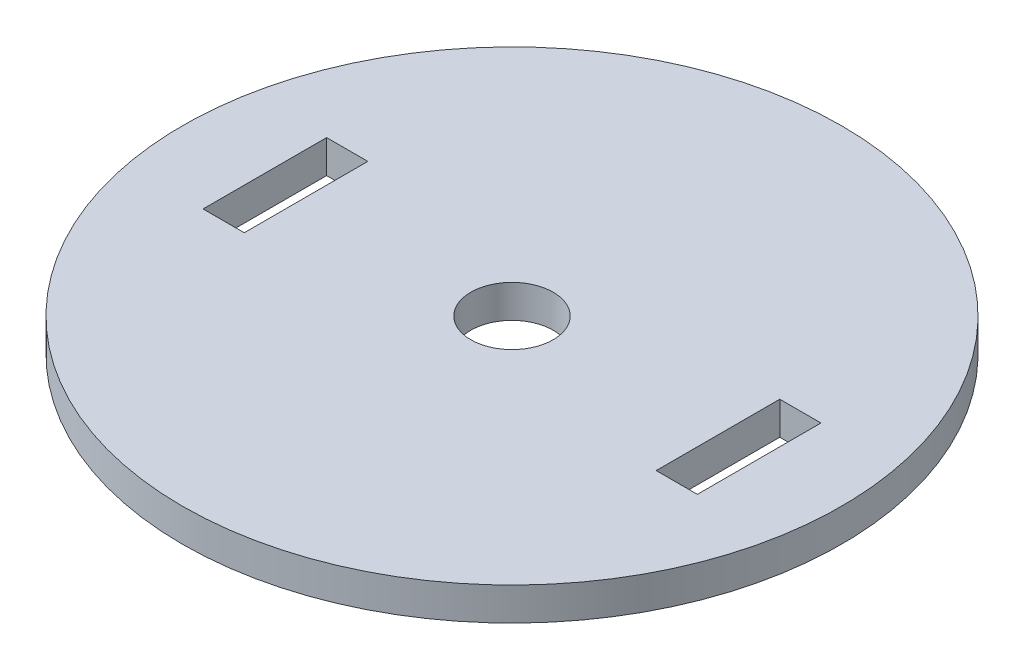
ISO-10303-21;
HEADER;
FILE_DESCRIPTION(('STEP AP214'),'2;1');
FILE_NAME('part.step','',(''),(''),'','','');
FILE_SCHEMA(('AUTOMOTIVE_DESIGN { 1 0 10303 214 1 1 1 1 }'));
ENDSEC;
DATA;
#1=APPLICATION_CONTEXT('core data for automotive mechanical design processes');
#2=APPLICATION_PROTOCOL_DEFINITION('international standard','automotive_design',2000,#1);
#3=PRODUCT_CONTEXT('',#1,'mechanical');
#4=PRODUCT('Part','Part','',(#3));
#5=PRODUCT_RELATED_PRODUCT_CATEGORY('part','',(#4));
#6=PRODUCT_DEFINITION_FORMATION('','',#4);
#7=PRODUCT_DEFINITION_CONTEXT('part definition',#1,'design');
#8=PRODUCT_DEFINITION('design','',#6,#7);
#9=PRODUCT_DEFINITION_SHAPE('','',#8);
#10=(LENGTH_UNIT() NAMED_UNIT(*) SI_UNIT(.MILLI.,.METRE.));
#11=(NAMED_UNIT(*) PLANE_ANGLE_UNIT() SI_UNIT($,.RADIAN.));
#12=(NAMED_UNIT(*) SI_UNIT($,.STERADIAN.) SOLID_ANGLE_UNIT());
#13=UNCERTAINTY_MEASURE_WITH_UNIT(LENGTH_MEASURE(1.E-05),#10,'distance_accuracy_value','');
#14=(GEOMETRIC_REPRESENTATION_CONTEXT(3) GLOBAL_UNCERTAINTY_ASSIGNED_CONTEXT((#13)) GLOBAL_UNIT_ASSIGNED_CONTEXT((#10,
#11,#12)) REPRESENTATION_CONTEXT('',''));
#15=CARTESIAN_POINT('',(0.,0.,0.));
#16=DIRECTION('',(0.,0.,1.));
#17=DIRECTION('',(1.,0.,0.));
#18=AXIS2_PLACEMENT_3D('',#15,#16,#17);
#19=CARTESIAN_POINT('',(0.,4.,0.));
#20=DIRECTION('',(0.,1.,0.));
#21=DIRECTION('',(0.,0.,1.));
#22=AXIS2_PLACEMENT_3D('',#19,#20,#21);
#23=PLANE('',#22);
#24=DIRECTION('',(0.,0.,-1.));
#25=VECTOR('',#24,1.);
#26=CARTESIAN_POINT('',(-25.,4.,7.49999999999999));
#27=LINE('',#26,#25);
#28=CARTESIAN_POINT('',(-25.,4.,7.49999999999999));
#29=VERTEX_POINT('',#28);
#30=CARTESIAN_POINT('',(-25.,4.,-7.50000000000001));
#31=VERTEX_POINT('',#30);
#32=EDGE_CURVE('E129',#29,#31,#27,.T.);
#33=ORIENTED_EDGE('',*,*,#32,.F.);
#34=DIRECTION('',(1.,0.,0.));
#35=VECTOR('',#34,1.);
#36=CARTESIAN_POINT('',(-30.,4.,7.49999999999999));
#37=LINE('',#36,#35);
#38=CARTESIAN_POINT('',(-30.,4.,7.49999999999999));
#39=VERTEX_POINT('',#38);
#40=EDGE_CURVE('E137',#39,#29,#37,.T.);
#41=ORIENTED_EDGE('',*,*,#40,.F.);
#42=DIRECTION('',(0.,0.,1.));
#43=VECTOR('',#42,1.);
#44=CARTESIAN_POINT('',(-30.,4.,7.49999999999999));
#45=LINE('',#44,#43);
#46=CARTESIAN_POINT('',(-30.,4.,-7.50000000000001));
#47=VERTEX_POINT('',#46);
#48=EDGE_CURVE('E151',#47,#39,#45,.T.);
#49=ORIENTED_EDGE('',*,*,#48,.F.);
#50=DIRECTION('',(-1.,0.,0.));
#51=VECTOR('',#50,1.);
#52=CARTESIAN_POINT('',(-30.,4.,-7.50000000000001));
#53=LINE('',#52,#51);
#54=EDGE_CURVE('E148',#31,#47,#53,.T.);
#55=ORIENTED_EDGE('',*,*,#54,.F.);
#56=EDGE_LOOP('',(#33,#41,#49,#55));
#57=FACE_BOUND('',#56,.T.);
#58=CARTESIAN_POINT('',(0.,4.,0.));
#59=DIRECTION('',(0.,1.,0.));
#60=DIRECTION('',(0.,0.,1.));
#61=AXIS2_PLACEMENT_3D('',#58,#59,#60);
#62=CIRCLE('',#61,40.);
#63=CARTESIAN_POINT('',(0.,4.,40.));
#64=VERTEX_POINT('',#63);
#65=EDGE_CURVE('E11',#64,#64,#62,.T.);
#66=ORIENTED_EDGE('',*,*,#65,.T.);
#67=EDGE_LOOP('',(#66));
#68=FACE_BOUND('',#67,.T.);
#69=CARTESIAN_POINT('',(0.,4.,0.));
#70=DIRECTION('',(0.,1.,0.));
#71=DIRECTION('',(0.,0.,1.));
#72=AXIS2_PLACEMENT_3D('',#69,#70,#71);
#73=CIRCLE('',#72,5.);
#74=CARTESIAN_POINT('',(0.,4.,5.));
#75=VERTEX_POINT('',#74);
#76=EDGE_CURVE('E165',#75,#75,#73,.T.);
#77=ORIENTED_EDGE('',*,*,#76,.F.);
#78=EDGE_LOOP('',(#77));
#79=FACE_BOUND('',#78,.T.);
#80=DIRECTION('',(-1.,0.,0.));
#81=VECTOR('',#80,1.);
#82=CARTESIAN_POINT('',(30.,4.,7.49999999999999));
#83=LINE('',#82,#81);
#84=CARTESIAN_POINT('',(30.,4.,7.49999999999999));
#85=VERTEX_POINT('',#84);
#86=CARTESIAN_POINT('',(25.,4.,7.49999999999999));
#87=VERTEX_POINT('',#86);
#88=EDGE_CURVE('E123',#85,#87,#83,.T.);
#89=ORIENTED_EDGE('',*,*,#88,.T.);
#90=DIRECTION('',(0.,0.,-1.));
#91=VECTOR('',#90,1.);
#92=CARTESIAN_POINT('',(25.,4.,7.49999999999999));
#93=LINE('',#92,#91);
#94=CARTESIAN_POINT('',(25.,4.,-7.50000000000001));
#95=VERTEX_POINT('',#94);
#96=EDGE_CURVE('E48',#87,#95,#93,.T.);
#97=ORIENTED_EDGE('',*,*,#96,.T.);
#98=DIRECTION('',(1.,0.,0.));
#99=VECTOR('',#98,1.);
#100=CARTESIAN_POINT('',(30.,4.,-7.50000000000001));
#101=LINE('',#100,#99);
#102=CARTESIAN_POINT('',(30.,4.,-7.50000000000001));
#103=VERTEX_POINT('',#102);
#104=EDGE_CURVE('E114',#95,#103,#101,.T.);
#105=ORIENTED_EDGE('',*,*,#104,.T.);
#106=DIRECTION('',(0.,0.,1.));
#107=VECTOR('',#106,1.);
#108=CARTESIAN_POINT('',(30.,4.,7.49999999999999));
#109=LINE('',#108,#107);
#110=EDGE_CURVE('E117',#103,#85,#109,.T.);
#111=ORIENTED_EDGE('',*,*,#110,.T.);
#112=EDGE_LOOP('',(#89,#97,#105,#111));
#113=FACE_BOUND('',#112,.T.);
#114=ADVANCED_FACE('F33',(#57,#68,#79,#113),#23,.T.);
#115=CARTESIAN_POINT('',(0.,0.,0.));
#116=DIRECTION('',(0.,1.,0.));
#117=DIRECTION('',(0.,0.,1.));
#118=AXIS2_PLACEMENT_3D('',#115,#116,#117);
#119=PLANE('',#118);
#120=CARTESIAN_POINT('',(0.,0.,0.));
#121=DIRECTION('',(0.,1.,0.));
#122=DIRECTION('',(0.,0.,1.));
#123=AXIS2_PLACEMENT_3D('',#120,#121,#122);
#124=CIRCLE('',#123,5.);
#125=CARTESIAN_POINT('',(0.,0.,5.));
#126=VERTEX_POINT('',#125);
#127=EDGE_CURVE('E158',#126,#126,#124,.T.);
#128=ORIENTED_EDGE('',*,*,#127,.T.);
#129=EDGE_LOOP('',(#128));
#130=FACE_BOUND('',#129,.T.);
#131=CARTESIAN_POINT('',(0.,0.,0.));
#132=DIRECTION('',(0.,1.,0.));
#133=DIRECTION('',(0.,0.,1.));
#134=AXIS2_PLACEMENT_3D('',#131,#132,#133);
#135=CIRCLE('',#134,40.);
#136=CARTESIAN_POINT('',(0.,0.,40.));
#137=VERTEX_POINT('',#136);
#138=EDGE_CURVE('E37',#137,#137,#135,.T.);
#139=ORIENTED_EDGE('',*,*,#138,.F.);
#140=EDGE_LOOP('',(#139));
#141=FACE_BOUND('',#140,.T.);
#142=DIRECTION('',(1.,0.,0.));
#143=VECTOR('',#142,1.);
#144=CARTESIAN_POINT('',(-30.,0.,7.49999999999999));
#145=LINE('',#144,#143);
#146=CARTESIAN_POINT('',(-30.,0.,7.49999999999999));
#147=VERTEX_POINT('',#146);
#148=CARTESIAN_POINT('',(-25.,0.,7.49999999999999));
#149=VERTEX_POINT('',#148);
#150=EDGE_CURVE('E143',#147,#149,#145,.T.);
#151=ORIENTED_EDGE('',*,*,#150,.T.);
#152=DIRECTION('',(0.,0.,-1.));
#153=VECTOR('',#152,1.);
#154=CARTESIAN_POINT('',(-25.,0.,7.49999999999999));
#155=LINE('',#154,#153);
#156=CARTESIAN_POINT('',(-25.,0.,-7.50000000000001));
#157=VERTEX_POINT('',#156);
#158=EDGE_CURVE('E133',#149,#157,#155,.T.);
#159=ORIENTED_EDGE('',*,*,#158,.T.);
#160=DIRECTION('',(-1.,0.,0.));
#161=VECTOR('',#160,1.);
#162=CARTESIAN_POINT('',(-30.,0.,-7.50000000000001));
#163=LINE('',#162,#161);
#164=CARTESIAN_POINT('',(-30.,0.,-7.50000000000001));
#165=VERTEX_POINT('',#164);
#166=EDGE_CURVE('E136',#157,#165,#163,.T.);
#167=ORIENTED_EDGE('',*,*,#166,.T.);
#168=DIRECTION('',(0.,0.,1.));
#169=VECTOR('',#168,1.);
#170=CARTESIAN_POINT('',(-30.,0.,7.49999999999999));
#171=LINE('',#170,#169);
#172=EDGE_CURVE('E140',#165,#147,#171,.T.);
#173=ORIENTED_EDGE('',*,*,#172,.T.);
#174=EDGE_LOOP('',(#151,#159,#167,#173));
#175=FACE_BOUND('',#174,.T.);
#176=DIRECTION('',(0.,0.,-1.));
#177=VECTOR('',#176,1.);
#178=CARTESIAN_POINT('',(25.,0.,7.49999999999999));
#179=LINE('',#178,#177);
#180=CARTESIAN_POINT('',(25.,0.,7.49999999999999));
#181=VERTEX_POINT('',#180);
#182=CARTESIAN_POINT('',(25.,0.,-7.50000000000001));
#183=VERTEX_POINT('',#182);
#184=EDGE_CURVE('E106',#181,#183,#179,.T.);
#185=ORIENTED_EDGE('',*,*,#184,.F.);
#186=DIRECTION('',(-1.,0.,0.));
#187=VECTOR('',#186,1.);
#188=CARTESIAN_POINT('',(30.,0.,7.49999999999999));
#189=LINE('',#188,#187);
#190=CARTESIAN_POINT('',(30.,0.,7.49999999999999));
#191=VERTEX_POINT('',#190);
#192=EDGE_CURVE('E98',#191,#181,#189,.T.);
#193=ORIENTED_EDGE('',*,*,#192,.F.);
#194=DIRECTION('',(0.,0.,1.));
#195=VECTOR('',#194,1.);
#196=CARTESIAN_POINT('',(30.,0.,7.49999999999999));
#197=LINE('',#196,#195);
#198=CARTESIAN_POINT('',(30.,0.,-7.50000000000001));
#199=VERTEX_POINT('',#198);
#200=EDGE_CURVE('E105',#199,#191,#197,.T.);
#201=ORIENTED_EDGE('',*,*,#200,.F.);
#202=DIRECTION('',(1.,0.,0.));
#203=VECTOR('',#202,1.);
#204=CARTESIAN_POINT('',(30.,0.,-7.50000000000001));
#205=LINE('',#204,#203);
#206=EDGE_CURVE('E110',#183,#199,#205,.T.);
#207=ORIENTED_EDGE('',*,*,#206,.F.);
#208=EDGE_LOOP('',(#185,#193,#201,#207));
#209=FACE_BOUND('',#208,.T.);
#210=ADVANCED_FACE('F113',(#130,#141,#175,#209),#119,.F.);
#211=CARTESIAN_POINT('',(0.,4.,0.));
#212=DIRECTION('',(0.,-1.,0.));
#213=DIRECTION('',(0.,0.,-1.));
#214=AXIS2_PLACEMENT_3D('',#211,#212,#213);
#215=CYLINDRICAL_SURFACE('',#214,40.);
#216=ORIENTED_EDGE('',*,*,#65,.F.);
#217=EDGE_LOOP('',(#216));
#218=FACE_BOUND('',#217,.T.);
#219=ORIENTED_EDGE('',*,*,#138,.T.);
#220=EDGE_LOOP('',(#219));
#221=FACE_BOUND('',#220,.T.);
#222=ADVANCED_FACE('F35',(#218,#221),#215,.T.);
#223=CARTESIAN_POINT('',(0.,4.,0.));
#224=DIRECTION('',(0.,-1.,0.));
#225=DIRECTION('',(0.,0.,-1.));
#226=AXIS2_PLACEMENT_3D('',#223,#224,#225);
#227=CYLINDRICAL_SURFACE('',#226,5.);
#228=ORIENTED_EDGE('',*,*,#76,.T.);
#229=EDGE_LOOP('',(#228));
#230=FACE_BOUND('',#229,.T.);
#231=ORIENTED_EDGE('',*,*,#127,.F.);
#232=EDGE_LOOP('',(#231));
#233=FACE_BOUND('',#232,.T.);
#234=ADVANCED_FACE('F173',(#230,#233),#227,.F.);
#235=CARTESIAN_POINT('',(-25.,0.,7.49999999999999));
#236=DIRECTION('',(1.,0.,0.));
#237=DIRECTION('',(0.,0.,-1.));
#238=AXIS2_PLACEMENT_3D('',#235,#236,#237);
#239=PLANE('',#238);
#240=ORIENTED_EDGE('',*,*,#32,.T.);
#241=DIRECTION('',(0.,1.,0.));
#242=VECTOR('',#241,1.);
#243=CARTESIAN_POINT('',(-25.,0.,-7.50000000000001));
#244=LINE('',#243,#242);
#245=EDGE_CURVE('E146',#157,#31,#244,.T.);
#246=ORIENTED_EDGE('',*,*,#245,.F.);
#247=ORIENTED_EDGE('',*,*,#158,.F.);
#248=DIRECTION('',(0.,1.,0.));
#249=VECTOR('',#248,1.);
#250=CARTESIAN_POINT('',(-25.,0.,7.49999999999999));
#251=LINE('',#250,#249);
#252=EDGE_CURVE('E156',#149,#29,#251,.T.);
#253=ORIENTED_EDGE('',*,*,#252,.T.);
#254=EDGE_LOOP('',(#240,#246,#247,#253));
#255=FACE_BOUND('',#254,.T.);
#256=ADVANCED_FACE('F175',(#255),#239,.F.);
#257=CARTESIAN_POINT('',(-30.,0.,7.49999999999999));
#258=DIRECTION('',(0.,0.,1.));
#259=DIRECTION('',(1.,0.,0.));
#260=AXIS2_PLACEMENT_3D('',#257,#258,#259);
#261=PLANE('',#260);
#262=ORIENTED_EDGE('',*,*,#40,.T.);
#263=ORIENTED_EDGE('',*,*,#252,.F.);
#264=ORIENTED_EDGE('',*,*,#150,.F.);
#265=DIRECTION('',(0.,1.,0.));
#266=VECTOR('',#265,1.);
#267=CARTESIAN_POINT('',(-30.,0.,7.49999999999999));
#268=LINE('',#267,#266);
#269=EDGE_CURVE('E159',#147,#39,#268,.T.);
#270=ORIENTED_EDGE('',*,*,#269,.T.);
#271=EDGE_LOOP('',(#262,#263,#264,#270));
#272=FACE_BOUND('',#271,.T.);
#273=ADVANCED_FACE('F182',(#272),#261,.F.);
#274=CARTESIAN_POINT('',(-30.,0.,7.49999999999999));
#275=DIRECTION('',(-1.,0.,0.));
#276=DIRECTION('',(0.,0.,1.));
#277=AXIS2_PLACEMENT_3D('',#274,#275,#276);
#278=PLANE('',#277);
#279=ORIENTED_EDGE('',*,*,#48,.T.);
#280=ORIENTED_EDGE('',*,*,#269,.F.);
#281=ORIENTED_EDGE('',*,*,#172,.F.);
#282=DIRECTION('',(0.,1.,0.));
#283=VECTOR('',#282,1.);
#284=CARTESIAN_POINT('',(-30.,0.,-7.50000000000001));
#285=LINE('',#284,#283);
#286=EDGE_CURVE('E161',#165,#47,#285,.T.);
#287=ORIENTED_EDGE('',*,*,#286,.T.);
#288=EDGE_LOOP('',(#279,#280,#281,#287));
#289=FACE_BOUND('',#288,.T.);
#290=ADVANCED_FACE('F220',(#289),#278,.F.);
#291=CARTESIAN_POINT('',(-30.,0.,-7.50000000000001));
#292=DIRECTION('',(0.,0.,-1.));
#293=DIRECTION('',(-1.,0.,0.));
#294=AXIS2_PLACEMENT_3D('',#291,#292,#293);
#295=PLANE('',#294);
#296=ORIENTED_EDGE('',*,*,#54,.T.);
#297=ORIENTED_EDGE('',*,*,#286,.F.);
#298=ORIENTED_EDGE('',*,*,#166,.F.);
#299=ORIENTED_EDGE('',*,*,#245,.T.);
#300=EDGE_LOOP('',(#296,#297,#298,#299));
#301=FACE_BOUND('',#300,.T.);
#302=ADVANCED_FACE('F213',(#301),#295,.F.);
#303=CARTESIAN_POINT('',(25.,0.,7.49999999999999));
#304=DIRECTION('',(1.,0.,0.));
#305=DIRECTION('',(0.,0.,-1.));
#306=AXIS2_PLACEMENT_3D('',#303,#304,#305);
#307=PLANE('',#306);
#308=ORIENTED_EDGE('',*,*,#96,.F.);
#309=DIRECTION('',(0.,1.,0.));
#310=VECTOR('',#309,1.);
#311=CARTESIAN_POINT('',(25.,0.,7.49999999999999));
#312=LINE('',#311,#310);
#313=EDGE_CURVE('E100',#181,#87,#312,.T.);
#314=ORIENTED_EDGE('',*,*,#313,.F.);
#315=ORIENTED_EDGE('',*,*,#184,.T.);
#316=DIRECTION('',(0.,1.,0.));
#317=VECTOR('',#316,1.);
#318=CARTESIAN_POINT('',(25.,0.,-7.50000000000001));
#319=LINE('',#318,#317);
#320=EDGE_CURVE('E127',#183,#95,#319,.T.);
#321=ORIENTED_EDGE('',*,*,#320,.T.);
#322=EDGE_LOOP('',(#308,#314,#315,#321));
#323=FACE_BOUND('',#322,.T.);
#324=ADVANCED_FACE('F108',(#323),#307,.T.);
#325=CARTESIAN_POINT('',(30.,0.,-7.50000000000001));
#326=DIRECTION('',(0.,0.,1.));
#327=DIRECTION('',(1.,0.,0.));
#328=AXIS2_PLACEMENT_3D('',#325,#326,#327);
#329=PLANE('',#328);
#330=ORIENTED_EDGE('',*,*,#104,.F.);
#331=ORIENTED_EDGE('',*,*,#320,.F.);
#332=ORIENTED_EDGE('',*,*,#206,.T.);
#333=DIRECTION('',(0.,1.,0.));
#334=VECTOR('',#333,1.);
#335=CARTESIAN_POINT('',(30.,0.,-7.50000000000001));
#336=LINE('',#335,#334);
#337=EDGE_CURVE('E130',#199,#103,#336,.T.);
#338=ORIENTED_EDGE('',*,*,#337,.T.);
#339=EDGE_LOOP('',(#330,#331,#332,#338));
#340=FACE_BOUND('',#339,.T.);
#341=ADVANCED_FACE('F205',(#340),#329,.T.);
#342=CARTESIAN_POINT('',(30.,0.,7.49999999999999));
#343=DIRECTION('',(-1.,0.,0.));
#344=DIRECTION('',(0.,0.,1.));
#345=AXIS2_PLACEMENT_3D('',#342,#343,#344);
#346=PLANE('',#345);
#347=ORIENTED_EDGE('',*,*,#110,.F.);
#348=ORIENTED_EDGE('',*,*,#337,.F.);
#349=ORIENTED_EDGE('',*,*,#200,.T.);
#350=DIRECTION('',(0.,1.,0.));
#351=VECTOR('',#350,1.);
#352=CARTESIAN_POINT('',(30.,0.,7.49999999999999));
#353=LINE('',#352,#351);
#354=EDGE_CURVE('E56',#191,#85,#353,.T.);
#355=ORIENTED_EDGE('',*,*,#354,.T.);
#356=EDGE_LOOP('',(#347,#348,#349,#355));
#357=FACE_BOUND('',#356,.T.);
#358=ADVANCED_FACE('F203',(#357),#346,.T.);
#359=CARTESIAN_POINT('',(30.,0.,7.49999999999999));
#360=DIRECTION('',(0.,0.,-1.));
#361=DIRECTION('',(-1.,0.,0.));
#362=AXIS2_PLACEMENT_3D('',#359,#360,#361);
#363=PLANE('',#362);
#364=ORIENTED_EDGE('',*,*,#88,.F.);
#365=ORIENTED_EDGE('',*,*,#354,.F.);
#366=ORIENTED_EDGE('',*,*,#192,.T.);
#367=ORIENTED_EDGE('',*,*,#313,.T.);
#368=EDGE_LOOP('',(#364,#365,#366,#367));
#369=FACE_BOUND('',#368,.T.);
#370=ADVANCED_FACE('F99',(#369),#363,.T.);
#371=CLOSED_SHELL('',(#114,#210,#222,#234,#256,#273,#290,#302,#324,#341,#358,#370));
#372=MANIFOLD_SOLID_BREP('B2',#371);
#373=ADVANCED_BREP_SHAPE_REPRESENTATION('',(#18,#372),#14);
#374=SHAPE_DEFINITION_REPRESENTATION(#9,#373);
ENDSEC;
END-ISO-10303-21;
